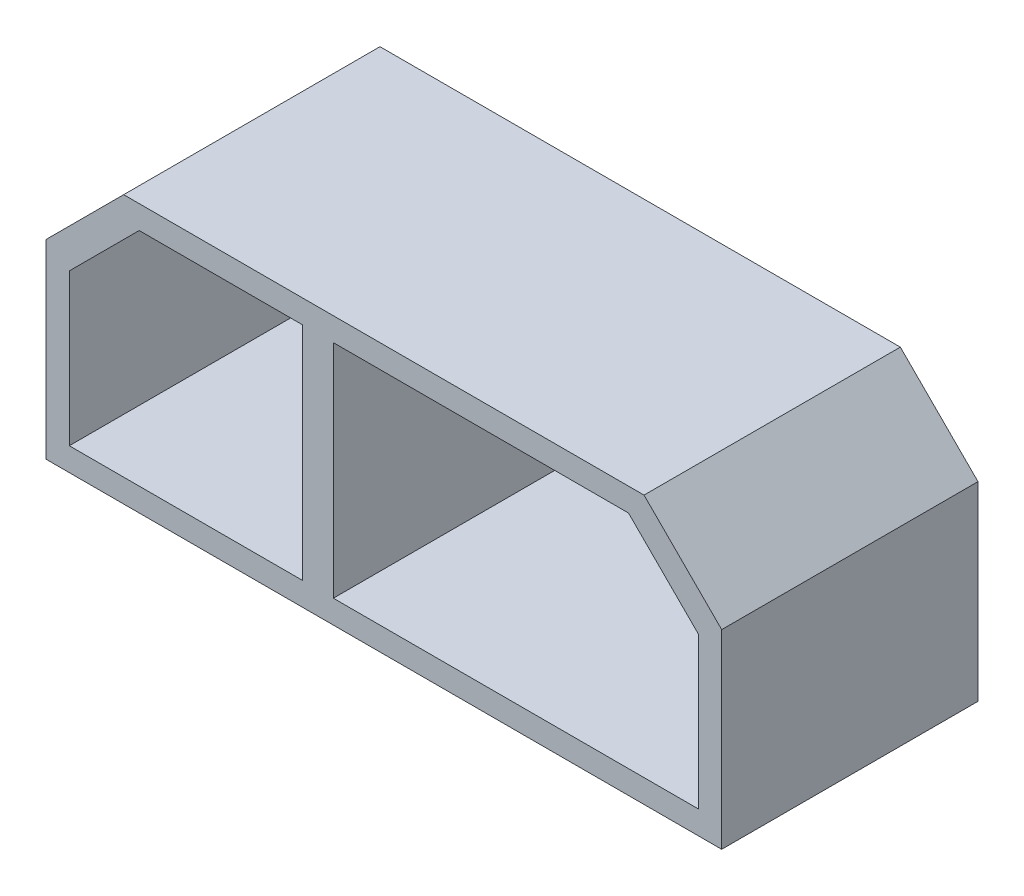
ISO-10303-21;
HEADER;
FILE_DESCRIPTION(('STEP AP214'),'2;1');
FILE_NAME('part.step','',(''),(''),'','','');
FILE_SCHEMA(('AUTOMOTIVE_DESIGN { 1 0 10303 214 1 1 1 1 }'));
ENDSEC;
DATA;
#1=APPLICATION_CONTEXT('core data for automotive mechanical design processes');
#2=APPLICATION_PROTOCOL_DEFINITION('international standard','automotive_design',2000,#1);
#3=PRODUCT_CONTEXT('',#1,'mechanical');
#4=PRODUCT('Part','Part','',(#3));
#5=PRODUCT_RELATED_PRODUCT_CATEGORY('part','',(#4));
#6=PRODUCT_DEFINITION_FORMATION('','',#4);
#7=PRODUCT_DEFINITION_CONTEXT('part definition',#1,'design');
#8=PRODUCT_DEFINITION('design','',#6,#7);
#9=PRODUCT_DEFINITION_SHAPE('','',#8);
#10=(LENGTH_UNIT() NAMED_UNIT(*) SI_UNIT(.MILLI.,.METRE.));
#11=(NAMED_UNIT(*) PLANE_ANGLE_UNIT() SI_UNIT($,.RADIAN.));
#12=(NAMED_UNIT(*) SI_UNIT($,.STERADIAN.) SOLID_ANGLE_UNIT());
#13=UNCERTAINTY_MEASURE_WITH_UNIT(LENGTH_MEASURE(1.E-05),#10,'distance_accuracy_value','');
#14=(GEOMETRIC_REPRESENTATION_CONTEXT(3) GLOBAL_UNCERTAINTY_ASSIGNED_CONTEXT((#13)) GLOBAL_UNIT_ASSIGNED_CONTEXT((#10,
#11,#12)) REPRESENTATION_CONTEXT('',''));
#15=CARTESIAN_POINT('',(0.,0.,0.));
#16=DIRECTION('',(0.,0.,1.));
#17=DIRECTION('',(1.,0.,0.));
#18=AXIS2_PLACEMENT_3D('',#15,#16,#17);
#19=CARTESIAN_POINT('',(0.,0.,3.));
#20=DIRECTION('',(0.,0.,-1.));
#21=DIRECTION('',(-1.,0.,0.));
#22=AXIS2_PLACEMENT_3D('',#19,#20,#21);
#23=PLANE('',#22);
#24=DIRECTION('',(0.707106781186547,0.707106781186548,0.));
#25=VECTOR('',#24,1.);
#26=CARTESIAN_POINT('',(-3.,16.5,3.));
#27=LINE('',#26,#25);
#28=CARTESIAN_POINT('',(0.,19.5,3.));
#29=VERTEX_POINT('',#28);
#30=CARTESIAN_POINT('',(9.,28.5,3.));
#31=VERTEX_POINT('',#30);
#32=EDGE_CURVE('E187',#29,#31,#27,.T.);
#33=ORIENTED_EDGE('',*,*,#32,.F.);
#34=DIRECTION('',(0.,-1.,0.));
#35=VECTOR('',#34,1.);
#36=CARTESIAN_POINT('',(0.,0.,3.));
#37=LINE('',#36,#35);
#38=CARTESIAN_POINT('',(0.,0.,3.));
#39=VERTEX_POINT('',#38);
#40=EDGE_CURVE('E178',#29,#39,#37,.T.);
#41=ORIENTED_EDGE('',*,*,#40,.T.);
#42=DIRECTION('',(1.,0.,0.));
#43=VECTOR('',#42,1.);
#44=CARTESIAN_POINT('',(0.,0.,3.));
#45=LINE('',#44,#43);
#46=CARTESIAN_POINT('',(29.9999999999999,0.,3.));
#47=VERTEX_POINT('',#46);
#48=EDGE_CURVE('E262',#39,#47,#45,.T.);
#49=ORIENTED_EDGE('',*,*,#48,.T.);
#50=DIRECTION('',(0.,-1.,0.));
#51=VECTOR('',#50,1.);
#52=CARTESIAN_POINT('',(29.9999999999999,28.5,3.));
#53=LINE('',#52,#51);
#54=CARTESIAN_POINT('',(29.9999999999999,28.5,3.));
#55=VERTEX_POINT('',#54);
#56=EDGE_CURVE('E202',#55,#47,#53,.T.);
#57=ORIENTED_EDGE('',*,*,#56,.F.);
#58=DIRECTION('',(-1.,0.,0.));
#59=VECTOR('',#58,1.);
#60=CARTESIAN_POINT('',(0.,28.5,3.));
#61=LINE('',#60,#59);
#62=EDGE_CURVE('E268',#55,#31,#61,.T.);
#63=ORIENTED_EDGE('',*,*,#62,.T.);
#64=EDGE_LOOP('',(#33,#41,#49,#57,#63));
#65=FACE_BOUND('',#64,.T.);
#66=ADVANCED_FACE('F43',(#65),#23,.F.);
#67=DIRECTION('',(0.707106781186547,-0.707106781186547,0.));
#68=VECTOR('',#67,1.);
#69=CARTESIAN_POINT('',(69.,31.5,3.));
#70=LINE('',#69,#68);
#71=CARTESIAN_POINT('',(72.,28.5,3.));
#72=VERTEX_POINT('',#71);
#73=CARTESIAN_POINT('',(81.,19.5,3.));
#74=VERTEX_POINT('',#73);
#75=EDGE_CURVE('E191',#72,#74,#70,.T.);
#76=ORIENTED_EDGE('',*,*,#75,.F.);
#77=CARTESIAN_POINT('',(34.,28.5,3.));
#78=VERTEX_POINT('',#77);
#79=EDGE_CURVE('E269',#72,#78,#61,.T.);
#80=ORIENTED_EDGE('',*,*,#79,.T.);
#81=DIRECTION('',(0.,1.,0.));
#82=VECTOR('',#81,1.);
#83=CARTESIAN_POINT('',(33.9999999999999,28.5,3.));
#84=LINE('',#83,#82);
#85=CARTESIAN_POINT('',(34.,0.,3.));
#86=VERTEX_POINT('',#85);
#87=EDGE_CURVE('E206',#86,#78,#84,.T.);
#88=ORIENTED_EDGE('',*,*,#87,.F.);
#89=CARTESIAN_POINT('',(81.,0.,3.));
#90=VERTEX_POINT('',#89);
#91=EDGE_CURVE('E261',#86,#90,#45,.T.);
#92=ORIENTED_EDGE('',*,*,#91,.T.);
#93=DIRECTION('',(0.,1.,0.));
#94=VECTOR('',#93,1.);
#95=CARTESIAN_POINT('',(81.,0.,3.));
#96=LINE('',#95,#94);
#97=EDGE_CURVE('E265',#90,#74,#96,.T.);
#98=ORIENTED_EDGE('',*,*,#97,.T.);
#99=EDGE_LOOP('',(#76,#80,#88,#92,#98));
#100=FACE_BOUND('',#99,.T.);
#101=ADVANCED_FACE('F307',(#100),#23,.F.);
#102=CARTESIAN_POINT('',(81.,28.5,0.));
#103=DIRECTION('',(0.,1.,0.));
#104=DIRECTION('',(0.,0.,1.));
#105=AXIS2_PLACEMENT_3D('',#102,#103,#104);
#106=PLANE('',#105);
#107=DIRECTION('',(0.,0.,1.));
#108=VECTOR('',#107,1.);
#109=CARTESIAN_POINT('',(8.99999999999999,28.5,0.));
#110=LINE('',#109,#108);
#111=CARTESIAN_POINT('',(9.00000000000002,28.5,33.));
#112=VERTEX_POINT('',#111);
#113=EDGE_CURVE('E181',#31,#112,#110,.T.);
#114=ORIENTED_EDGE('',*,*,#113,.F.);
#115=ORIENTED_EDGE('',*,*,#62,.F.);
#116=DIRECTION('',(0.,0.,-1.));
#117=VECTOR('',#116,1.);
#118=CARTESIAN_POINT('',(29.9999999999999,28.5,33.));
#119=LINE('',#118,#117);
#120=CARTESIAN_POINT('',(29.9999999999999,28.5,33.));
#121=VERTEX_POINT('',#120);
#122=EDGE_CURVE('E209',#121,#55,#119,.T.);
#123=ORIENTED_EDGE('',*,*,#122,.F.);
#124=DIRECTION('',(-1.,0.,0.));
#125=VECTOR('',#124,1.);
#126=CARTESIAN_POINT('',(81.,28.5,33.));
#127=LINE('',#126,#125);
#128=EDGE_CURVE('E224',#121,#112,#127,.T.);
#129=ORIENTED_EDGE('',*,*,#128,.T.);
#130=EDGE_LOOP('',(#114,#115,#123,#129));
#131=FACE_BOUND('',#130,.T.);
#132=ADVANCED_FACE('F314',(#131),#106,.F.);
#133=DIRECTION('',(0.,0.,-1.));
#134=VECTOR('',#133,1.);
#135=CARTESIAN_POINT('',(72.,28.5,0.));
#136=LINE('',#135,#134);
#137=CARTESIAN_POINT('',(72.,28.5,33.));
#138=VERTEX_POINT('',#137);
#139=EDGE_CURVE('E182',#138,#72,#136,.T.);
#140=ORIENTED_EDGE('',*,*,#139,.F.);
#141=CARTESIAN_POINT('',(33.9999999999999,28.5,33.));
#142=VERTEX_POINT('',#141);
#143=EDGE_CURVE('E172',#138,#142,#127,.T.);
#144=ORIENTED_EDGE('',*,*,#143,.T.);
#145=DIRECTION('',(0.,0.,-1.));
#146=VECTOR('',#145,1.);
#147=CARTESIAN_POINT('',(33.9999999999999,28.5,33.));
#148=LINE('',#147,#146);
#149=EDGE_CURVE('E216',#142,#78,#148,.T.);
#150=ORIENTED_EDGE('',*,*,#149,.T.);
#151=ORIENTED_EDGE('',*,*,#79,.F.);
#152=EDGE_LOOP('',(#140,#144,#150,#151));
#153=FACE_BOUND('',#152,.T.);
#154=ADVANCED_FACE('F345',(#153),#106,.F.);
#155=CARTESIAN_POINT('',(81.,0.,0.));
#156=DIRECTION('',(1.,0.,0.));
#157=DIRECTION('',(0.,0.,-1.));
#158=AXIS2_PLACEMENT_3D('',#155,#156,#157);
#159=PLANE('',#158);
#160=DIRECTION('',(0.,0.,1.));
#161=VECTOR('',#160,1.);
#162=CARTESIAN_POINT('',(81.,19.5,0.));
#163=LINE('',#162,#161);
#164=CARTESIAN_POINT('',(81.,19.5,33.));
#165=VERTEX_POINT('',#164);
#166=EDGE_CURVE('E186',#74,#165,#163,.T.);
#167=ORIENTED_EDGE('',*,*,#166,.F.);
#168=ORIENTED_EDGE('',*,*,#97,.F.);
#169=DIRECTION('',(0.,0.,1.));
#170=VECTOR('',#169,1.);
#171=CARTESIAN_POINT('',(81.,0.,0.));
#172=LINE('',#171,#170);
#173=CARTESIAN_POINT('',(81.,0.,33.));
#174=VERTEX_POINT('',#173);
#175=EDGE_CURVE('E241',#90,#174,#172,.T.);
#176=ORIENTED_EDGE('',*,*,#175,.T.);
#177=DIRECTION('',(0.,1.,0.));
#178=VECTOR('',#177,1.);
#179=CARTESIAN_POINT('',(81.,0.,33.));
#180=LINE('',#179,#178);
#181=EDGE_CURVE('E227',#174,#165,#180,.T.);
#182=ORIENTED_EDGE('',*,*,#181,.T.);
#183=EDGE_LOOP('',(#167,#168,#176,#182));
#184=FACE_BOUND('',#183,.T.);
#185=ADVANCED_FACE('F342',(#184),#159,.F.);
#186=CARTESIAN_POINT('',(0.,28.5,0.));
#187=DIRECTION('',(-1.,0.,0.));
#188=DIRECTION('',(0.,0.,1.));
#189=AXIS2_PLACEMENT_3D('',#186,#187,#188);
#190=PLANE('',#189);
#191=DIRECTION('',(0.,0.,-1.));
#192=VECTOR('',#191,1.);
#193=CARTESIAN_POINT('',(0.,19.5,0.));
#194=LINE('',#193,#192);
#195=CARTESIAN_POINT('',(0.,19.5,33.));
#196=VERTEX_POINT('',#195);
#197=EDGE_CURVE('E176',#196,#29,#194,.T.);
#198=ORIENTED_EDGE('',*,*,#197,.F.);
#199=DIRECTION('',(0.,-1.,0.));
#200=VECTOR('',#199,1.);
#201=CARTESIAN_POINT('',(0.,28.5,33.));
#202=LINE('',#201,#200);
#203=CARTESIAN_POINT('',(0.,0.,33.));
#204=VERTEX_POINT('',#203);
#205=EDGE_CURVE('E160',#196,#204,#202,.T.);
#206=ORIENTED_EDGE('',*,*,#205,.T.);
#207=DIRECTION('',(0.,0.,1.));
#208=VECTOR('',#207,1.);
#209=CARTESIAN_POINT('',(0.,0.,0.));
#210=LINE('',#209,#208);
#211=EDGE_CURVE('E240',#39,#204,#210,.T.);
#212=ORIENTED_EDGE('',*,*,#211,.F.);
#213=ORIENTED_EDGE('',*,*,#40,.F.);
#214=EDGE_LOOP('',(#198,#206,#212,#213));
#215=FACE_BOUND('',#214,.T.);
#216=ADVANCED_FACE('F177',(#215),#190,.F.);
#217=CARTESIAN_POINT('',(0.,0.,0.));
#218=DIRECTION('',(0.,-1.,0.));
#219=DIRECTION('',(0.,0.,-1.));
#220=AXIS2_PLACEMENT_3D('',#217,#218,#219);
#221=PLANE('',#220);
#222=DIRECTION('',(0.,0.,-1.));
#223=VECTOR('',#222,1.);
#224=CARTESIAN_POINT('',(29.9999999999999,0.,33.));
#225=LINE('',#224,#223);
#226=CARTESIAN_POINT('',(29.9999999999999,0.,33.));
#227=VERTEX_POINT('',#226);
#228=EDGE_CURVE('E222',#227,#47,#225,.T.);
#229=ORIENTED_EDGE('',*,*,#228,.T.);
#230=ORIENTED_EDGE('',*,*,#48,.F.);
#231=ORIENTED_EDGE('',*,*,#211,.T.);
#232=DIRECTION('',(1.,0.,0.));
#233=VECTOR('',#232,1.);
#234=CARTESIAN_POINT('',(0.,0.,33.));
#235=LINE('',#234,#233);
#236=EDGE_CURVE('E167',#204,#227,#235,.T.);
#237=ORIENTED_EDGE('',*,*,#236,.T.);
#238=EDGE_LOOP('',(#229,#230,#231,#237));
#239=FACE_BOUND('',#238,.T.);
#240=ADVANCED_FACE('F347',(#239),#221,.F.);
#241=DIRECTION('',(0.,0.,-1.));
#242=VECTOR('',#241,1.);
#243=CARTESIAN_POINT('',(34.,0.,33.));
#244=LINE('',#243,#242);
#245=CARTESIAN_POINT('',(34.,0.,33.));
#246=VERTEX_POINT('',#245);
#247=EDGE_CURVE('E219',#246,#86,#244,.T.);
#248=ORIENTED_EDGE('',*,*,#247,.F.);
#249=EDGE_CURVE('E171',#246,#174,#235,.T.);
#250=ORIENTED_EDGE('',*,*,#249,.T.);
#251=ORIENTED_EDGE('',*,*,#175,.F.);
#252=ORIENTED_EDGE('',*,*,#91,.F.);
#253=EDGE_LOOP('',(#248,#250,#251,#252));
#254=FACE_BOUND('',#253,.T.);
#255=ADVANCED_FACE('F350',(#254),#221,.F.);
#256=CARTESIAN_POINT('',(-3.,-3.00000000000001,0.));
#257=DIRECTION('',(-1.,0.,0.));
#258=DIRECTION('',(0.,0.,1.));
#259=AXIS2_PLACEMENT_3D('',#256,#257,#258);
#260=PLANE('',#259);
#261=DIRECTION('',(0.,-1.,0.));
#262=VECTOR('',#261,1.);
#263=CARTESIAN_POINT('',(-3.,-3.00000000000001,33.));
#264=LINE('',#263,#262);
#265=CARTESIAN_POINT('',(-3.,21.4999999999999,33.));
#266=VERTEX_POINT('',#265);
#267=CARTESIAN_POINT('',(-3.,-3.00000000000001,33.));
#268=VERTEX_POINT('',#267);
#269=EDGE_CURVE('E229',#266,#268,#264,.T.);
#270=ORIENTED_EDGE('',*,*,#269,.F.);
#271=DIRECTION('',(0.,0.,-1.));
#272=VECTOR('',#271,1.);
#273=CARTESIAN_POINT('',(-3.,21.4999999999999,0.));
#274=LINE('',#273,#272);
#275=CARTESIAN_POINT('',(-3.,21.4999999999999,0.));
#276=VERTEX_POINT('',#275);
#277=EDGE_CURVE('E67',#266,#276,#274,.T.);
#278=ORIENTED_EDGE('',*,*,#277,.T.);
#279=DIRECTION('',(0.,-1.,0.));
#280=VECTOR('',#279,1.);
#281=CARTESIAN_POINT('',(-3.,-3.00000000000001,0.));
#282=LINE('',#281,#280);
#283=CARTESIAN_POINT('',(-3.,-3.00000000000001,0.));
#284=VERTEX_POINT('',#283);
#285=EDGE_CURVE('E244',#276,#284,#282,.T.);
#286=ORIENTED_EDGE('',*,*,#285,.T.);
#287=DIRECTION('',(0.,0.,1.));
#288=VECTOR('',#287,1.);
#289=CARTESIAN_POINT('',(-3.,-3.00000000000001,0.));
#290=LINE('',#289,#288);
#291=EDGE_CURVE('E255',#284,#268,#290,.T.);
#292=ORIENTED_EDGE('',*,*,#291,.T.);
#293=EDGE_LOOP('',(#270,#278,#286,#292));
#294=FACE_BOUND('',#293,.T.);
#295=ADVANCED_FACE('F291',(#294),#260,.T.);
#296=CARTESIAN_POINT('',(84.,31.5,0.));
#297=DIRECTION('',(0.,1.,0.));
#298=DIRECTION('',(-1.,0.,0.));
#299=AXIS2_PLACEMENT_3D('',#296,#297,#298);
#300=PLANE('',#299);
#301=DIRECTION('',(-1.,0.,0.));
#302=VECTOR('',#301,1.);
#303=CARTESIAN_POINT('',(84.,31.5,0.));
#304=LINE('',#303,#302);
#305=CARTESIAN_POINT('',(74.,31.5,0.));
#306=VERTEX_POINT('',#305);
#307=CARTESIAN_POINT('',(7.00000000000001,31.5,0.));
#308=VERTEX_POINT('',#307);
#309=EDGE_CURVE('E252',#306,#308,#304,.T.);
#310=ORIENTED_EDGE('',*,*,#309,.T.);
#311=DIRECTION('',(0.,0.,1.));
#312=VECTOR('',#311,1.);
#313=CARTESIAN_POINT('',(7.00000000000001,31.5,0.));
#314=LINE('',#313,#312);
#315=CARTESIAN_POINT('',(7.00000000000001,31.5,33.));
#316=VERTEX_POINT('',#315);
#317=EDGE_CURVE('E273',#308,#316,#314,.T.);
#318=ORIENTED_EDGE('',*,*,#317,.T.);
#319=DIRECTION('',(-1.,0.,0.));
#320=VECTOR('',#319,1.);
#321=CARTESIAN_POINT('',(84.,31.5,33.));
#322=LINE('',#321,#320);
#323=CARTESIAN_POINT('',(74.,31.5,33.));
#324=VERTEX_POINT('',#323);
#325=EDGE_CURVE('E237',#324,#316,#322,.T.);
#326=ORIENTED_EDGE('',*,*,#325,.F.);
#327=DIRECTION('',(0.,0.,-1.));
#328=VECTOR('',#327,1.);
#329=CARTESIAN_POINT('',(74.,31.5,0.));
#330=LINE('',#329,#328);
#331=EDGE_CURVE('E271',#324,#306,#330,.T.);
#332=ORIENTED_EDGE('',*,*,#331,.T.);
#333=EDGE_LOOP('',(#310,#318,#326,#332));
#334=FACE_BOUND('',#333,.T.);
#335=ADVANCED_FACE('F287',(#334),#300,.T.);
#336=CARTESIAN_POINT('',(84.,-3.,0.));
#337=DIRECTION('',(1.,0.,0.));
#338=DIRECTION('',(0.,0.,-1.));
#339=AXIS2_PLACEMENT_3D('',#336,#337,#338);
#340=PLANE('',#339);
#341=DIRECTION('',(0.,1.,0.));
#342=VECTOR('',#341,1.);
#343=CARTESIAN_POINT('',(84.,-3.,0.));
#344=LINE('',#343,#342);
#345=CARTESIAN_POINT('',(84.,-3.,0.));
#346=VERTEX_POINT('',#345);
#347=CARTESIAN_POINT('',(84.,21.5,0.));
#348=VERTEX_POINT('',#347);
#349=EDGE_CURVE('E250',#346,#348,#344,.T.);
#350=ORIENTED_EDGE('',*,*,#349,.T.);
#351=DIRECTION('',(0.,0.,1.));
#352=VECTOR('',#351,1.);
#353=CARTESIAN_POINT('',(84.,21.5,0.));
#354=LINE('',#353,#352);
#355=CARTESIAN_POINT('',(84.,21.5,33.));
#356=VERTEX_POINT('',#355);
#357=EDGE_CURVE('E11',#348,#356,#354,.T.);
#358=ORIENTED_EDGE('',*,*,#357,.T.);
#359=DIRECTION('',(0.,1.,0.));
#360=VECTOR('',#359,1.);
#361=CARTESIAN_POINT('',(84.,-3.,33.));
#362=LINE('',#361,#360);
#363=CARTESIAN_POINT('',(84.,-3.,33.));
#364=VERTEX_POINT('',#363);
#365=EDGE_CURVE('E234',#364,#356,#362,.T.);
#366=ORIENTED_EDGE('',*,*,#365,.F.);
#367=DIRECTION('',(0.,0.,1.));
#368=VECTOR('',#367,1.);
#369=CARTESIAN_POINT('',(84.,-3.,0.));
#370=LINE('',#369,#368);
#371=EDGE_CURVE('E256',#346,#364,#370,.T.);
#372=ORIENTED_EDGE('',*,*,#371,.F.);
#373=EDGE_LOOP('',(#350,#358,#366,#372));
#374=FACE_BOUND('',#373,.T.);
#375=ADVANCED_FACE('F298',(#374),#340,.T.);
#376=CARTESIAN_POINT('',(84.,-3.,0.));
#377=DIRECTION('',(0.,-1.,0.));
#378=DIRECTION('',(1.,0.,0.));
#379=AXIS2_PLACEMENT_3D('',#376,#377,#378);
#380=PLANE('',#379);
#381=ORIENTED_EDGE('',*,*,#371,.T.);
#382=DIRECTION('',(1.,0.,0.));
#383=VECTOR('',#382,1.);
#384=CARTESIAN_POINT('',(84.,-3.,33.));
#385=LINE('',#384,#383);
#386=EDGE_CURVE('E231',#268,#364,#385,.T.);
#387=ORIENTED_EDGE('',*,*,#386,.F.);
#388=ORIENTED_EDGE('',*,*,#291,.F.);
#389=DIRECTION('',(1.,0.,0.));
#390=VECTOR('',#389,1.);
#391=CARTESIAN_POINT('',(84.,-3.,0.));
#392=LINE('',#391,#390);
#393=EDGE_CURVE('E247',#284,#346,#392,.T.);
#394=ORIENTED_EDGE('',*,*,#393,.T.);
#395=EDGE_LOOP('',(#381,#387,#388,#394));
#396=FACE_BOUND('',#395,.T.);
#397=ADVANCED_FACE('F295',(#396),#380,.T.);
#398=CARTESIAN_POINT('',(0.,0.,33.));
#399=DIRECTION('',(0.,0.,1.));
#400=DIRECTION('',(1.,0.,0.));
#401=AXIS2_PLACEMENT_3D('',#398,#399,#400);
#402=PLANE('',#401);
#403=ORIENTED_EDGE('',*,*,#143,.F.);
#404=DIRECTION('',(0.707106781186547,-0.707106781186547,0.));
#405=VECTOR('',#404,1.);
#406=CARTESIAN_POINT('',(69.,31.5,33.));
#407=LINE('',#406,#405);
#408=EDGE_CURVE('E196',#138,#165,#407,.T.);
#409=ORIENTED_EDGE('',*,*,#408,.T.);
#410=ORIENTED_EDGE('',*,*,#181,.F.);
#411=ORIENTED_EDGE('',*,*,#249,.F.);
#412=DIRECTION('',(0.,1.,0.));
#413=VECTOR('',#412,1.);
#414=CARTESIAN_POINT('',(33.9999999999999,28.5,33.));
#415=LINE('',#414,#413);
#416=EDGE_CURVE('E205',#246,#142,#415,.T.);
#417=ORIENTED_EDGE('',*,*,#416,.T.);
#418=EDGE_LOOP('',(#403,#409,#410,#411,#417));
#419=FACE_BOUND('',#418,.T.);
#420=DIRECTION('',(0.707106781186547,0.707106781186548,0.));
#421=VECTOR('',#420,1.);
#422=CARTESIAN_POINT('',(-3.,16.5,33.));
#423=LINE('',#422,#421);
#424=EDGE_CURVE('E165',#196,#112,#423,.T.);
#425=ORIENTED_EDGE('',*,*,#424,.T.);
#426=ORIENTED_EDGE('',*,*,#128,.F.);
#427=DIRECTION('',(0.,-1.,0.));
#428=VECTOR('',#427,1.);
#429=CARTESIAN_POINT('',(29.9999999999999,28.5,33.));
#430=LINE('',#429,#428);
#431=EDGE_CURVE('E203',#121,#227,#430,.T.);
#432=ORIENTED_EDGE('',*,*,#431,.T.);
#433=ORIENTED_EDGE('',*,*,#236,.F.);
#434=ORIENTED_EDGE('',*,*,#205,.F.);
#435=EDGE_LOOP('',(#425,#426,#432,#433,#434));
#436=FACE_BOUND('',#435,.T.);
#437=ORIENTED_EDGE('',*,*,#325,.T.);
#438=DIRECTION('',(0.707106781186546,0.707106781186549,0.));
#439=VECTOR('',#438,1.);
#440=CARTESIAN_POINT('',(-12.25,12.2499999999999,33.));
#441=LINE('',#440,#439);
#442=EDGE_CURVE('E278',#316,#266,#441,.F.);
#443=ORIENTED_EDGE('',*,*,#442,.T.);
#444=ORIENTED_EDGE('',*,*,#269,.T.);
#445=ORIENTED_EDGE('',*,*,#386,.T.);
#446=ORIENTED_EDGE('',*,*,#365,.T.);
#447=DIRECTION('',(0.707106781186549,-0.707106781186547,0.));
#448=VECTOR('',#447,1.);
#449=CARTESIAN_POINT('',(52.7499999999999,52.75,33.));
#450=LINE('',#449,#448);
#451=EDGE_CURVE('E276',#356,#324,#450,.F.);
#452=ORIENTED_EDGE('',*,*,#451,.T.);
#453=EDGE_LOOP('',(#437,#443,#444,#445,#446,#452));
#454=FACE_BOUND('',#453,.T.);
#455=ADVANCED_FACE('F162',(#419,#436,#454),#402,.T.);
#456=CARTESIAN_POINT('',(0.,0.,0.));
#457=DIRECTION('',(0.,0.,-1.));
#458=DIRECTION('',(-1.,0.,0.));
#459=AXIS2_PLACEMENT_3D('',#456,#457,#458);
#460=PLANE('',#459);
#461=ORIENTED_EDGE('',*,*,#285,.F.);
#462=DIRECTION('',(-0.707106781186546,-0.707106781186549,0.));
#463=VECTOR('',#462,1.);
#464=CARTESIAN_POINT('',(-12.25,12.2499999999999,0.));
#465=LINE('',#464,#463);
#466=EDGE_CURVE('E52',#276,#308,#465,.F.);
#467=ORIENTED_EDGE('',*,*,#466,.T.);
#468=ORIENTED_EDGE('',*,*,#309,.F.);
#469=DIRECTION('',(-0.707106781186549,0.707106781186547,0.));
#470=VECTOR('',#469,1.);
#471=CARTESIAN_POINT('',(52.7499999999999,52.75,0.));
#472=LINE('',#471,#470);
#473=EDGE_CURVE('E59',#306,#348,#472,.F.);
#474=ORIENTED_EDGE('',*,*,#473,.T.);
#475=ORIENTED_EDGE('',*,*,#349,.F.);
#476=ORIENTED_EDGE('',*,*,#393,.F.);
#477=EDGE_LOOP('',(#461,#467,#468,#474,#475,#476));
#478=FACE_BOUND('',#477,.T.);
#479=ADVANCED_FACE('F282',(#478),#460,.T.);
#480=CARTESIAN_POINT('',(29.9999999999999,28.5,33.));
#481=DIRECTION('',(1.,0.,0.));
#482=DIRECTION('',(0.,0.,-1.));
#483=AXIS2_PLACEMENT_3D('',#480,#481,#482);
#484=PLANE('',#483);
#485=ORIENTED_EDGE('',*,*,#56,.T.);
#486=ORIENTED_EDGE('',*,*,#228,.F.);
#487=ORIENTED_EDGE('',*,*,#431,.F.);
#488=ORIENTED_EDGE('',*,*,#122,.T.);
#489=EDGE_LOOP('',(#485,#486,#487,#488));
#490=FACE_BOUND('',#489,.T.);
#491=ADVANCED_FACE('F320',(#490),#484,.F.);
#492=CARTESIAN_POINT('',(33.9999999999999,28.5,33.));
#493=DIRECTION('',(-1.,0.,0.));
#494=DIRECTION('',(0.,-1.,0.));
#495=AXIS2_PLACEMENT_3D('',#492,#493,#494);
#496=PLANE('',#495);
#497=ORIENTED_EDGE('',*,*,#87,.T.);
#498=ORIENTED_EDGE('',*,*,#149,.F.);
#499=ORIENTED_EDGE('',*,*,#416,.F.);
#500=ORIENTED_EDGE('',*,*,#247,.T.);
#501=EDGE_LOOP('',(#497,#498,#499,#500));
#502=FACE_BOUND('',#501,.T.);
#503=ADVANCED_FACE('F330',(#502),#496,.F.);
#504=CARTESIAN_POINT('',(-3.,16.5,33.));
#505=DIRECTION('',(-0.707106781186548,0.707106781186547,0.));
#506=DIRECTION('',(-0.707106781186547,-0.707106781186548,0.));
#507=AXIS2_PLACEMENT_3D('',#504,#505,#506);
#508=PLANE('',#507);
#509=ORIENTED_EDGE('',*,*,#32,.T.);
#510=ORIENTED_EDGE('',*,*,#113,.T.);
#511=ORIENTED_EDGE('',*,*,#424,.F.);
#512=ORIENTED_EDGE('',*,*,#197,.T.);
#513=EDGE_LOOP('',(#509,#510,#511,#512));
#514=FACE_BOUND('',#513,.T.);
#515=ADVANCED_FACE('F185',(#514),#508,.F.);
#516=CARTESIAN_POINT('',(69.,31.5,33.));
#517=DIRECTION('',(0.707106781186547,0.707106781186547,0.));
#518=DIRECTION('',(-0.707106781186548,0.707106781186548,0.));
#519=AXIS2_PLACEMENT_3D('',#516,#517,#518);
#520=PLANE('',#519);
#521=ORIENTED_EDGE('',*,*,#408,.F.);
#522=ORIENTED_EDGE('',*,*,#139,.T.);
#523=ORIENTED_EDGE('',*,*,#75,.T.);
#524=ORIENTED_EDGE('',*,*,#166,.T.);
#525=EDGE_LOOP('',(#521,#522,#523,#524));
#526=FACE_BOUND('',#525,.T.);
#527=ADVANCED_FACE('F305',(#526),#520,.F.);
#528=CARTESIAN_POINT('',(7.00000000000001,31.5,0.));
#529=DIRECTION('',(0.707106781186549,-0.707106781186546,0.));
#530=DIRECTION('',(0.,0.,1.));
#531=AXIS2_PLACEMENT_3D('',#528,#529,#530);
#532=PLANE('',#531);
#533=ORIENTED_EDGE('',*,*,#466,.F.);
#534=ORIENTED_EDGE('',*,*,#277,.F.);
#535=ORIENTED_EDGE('',*,*,#442,.F.);
#536=ORIENTED_EDGE('',*,*,#317,.F.);
#537=EDGE_LOOP('',(#533,#534,#535,#536));
#538=FACE_BOUND('',#537,.T.);
#539=ADVANCED_FACE('F290',(#538),#532,.F.);
#540=CARTESIAN_POINT('',(84.,21.5,0.));
#541=DIRECTION('',(-0.707106781186546,-0.707106781186548,0.));
#542=DIRECTION('',(0.,0.,1.));
#543=AXIS2_PLACEMENT_3D('',#540,#541,#542);
#544=PLANE('',#543);
#545=ORIENTED_EDGE('',*,*,#473,.F.);
#546=ORIENTED_EDGE('',*,*,#331,.F.);
#547=ORIENTED_EDGE('',*,*,#451,.F.);
#548=ORIENTED_EDGE('',*,*,#357,.F.);
#549=EDGE_LOOP('',(#545,#546,#547,#548));
#550=FACE_BOUND('',#549,.T.);
#551=ADVANCED_FACE('F46',(#550),#544,.F.);
#552=CLOSED_SHELL('',(#66,#101,#132,#154,#185,#216,#240,#255,#295,#335,#375,#397,#455,#479,#491,
#503,#515,#527,#539,#551));
#553=MANIFOLD_SOLID_BREP('B2',#552);
#554=ADVANCED_BREP_SHAPE_REPRESENTATION('',(#18,#553),#14);
#555=SHAPE_DEFINITION_REPRESENTATION(#9,#554);
ENDSEC;
END-ISO-10303-21;
